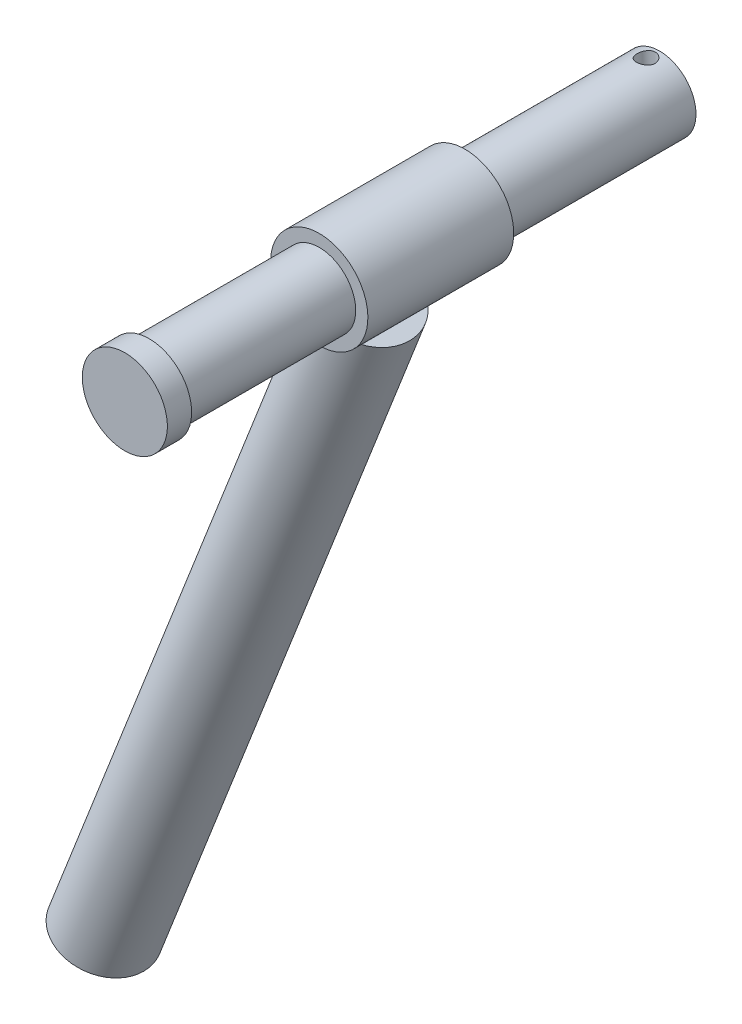
ISO-10303-21;
HEADER;
FILE_DESCRIPTION(('STEP AP214'),'2;1');
FILE_NAME('part.step','',(''),(''),'','','');
FILE_SCHEMA(('AUTOMOTIVE_DESIGN { 1 0 10303 214 1 1 1 1 }'));
ENDSEC;
DATA;
#1=APPLICATION_CONTEXT('core data for automotive mechanical design processes');
#2=APPLICATION_PROTOCOL_DEFINITION('international standard','automotive_design',2000,#1);
#3=PRODUCT_CONTEXT('',#1,'mechanical');
#4=PRODUCT('Part','Part','',(#3));
#5=PRODUCT_RELATED_PRODUCT_CATEGORY('part','',(#4));
#6=PRODUCT_DEFINITION_FORMATION('','',#4);
#7=PRODUCT_DEFINITION_CONTEXT('part definition',#1,'design');
#8=PRODUCT_DEFINITION('design','',#6,#7);
#9=PRODUCT_DEFINITION_SHAPE('','',#8);
#10=(LENGTH_UNIT() NAMED_UNIT(*) SI_UNIT(.MILLI.,.METRE.));
#11=(NAMED_UNIT(*) PLANE_ANGLE_UNIT() SI_UNIT($,.RADIAN.));
#12=(NAMED_UNIT(*) SI_UNIT($,.STERADIAN.) SOLID_ANGLE_UNIT());
#13=UNCERTAINTY_MEASURE_WITH_UNIT(LENGTH_MEASURE(1.E-05),#10,'distance_accuracy_value','');
#14=(GEOMETRIC_REPRESENTATION_CONTEXT(3) GLOBAL_UNCERTAINTY_ASSIGNED_CONTEXT((#13)) GLOBAL_UNIT_ASSIGNED_CONTEXT((#10,
#11,#12)) REPRESENTATION_CONTEXT('',''));
#15=CARTESIAN_POINT('',(0.,0.,0.));
#16=DIRECTION('',(0.,0.,1.));
#17=DIRECTION('',(1.,0.,0.));
#18=AXIS2_PLACEMENT_3D('',#15,#16,#17);
#19=CARTESIAN_POINT('',(-246.40968033927,1110.73942071581,4229.13224485644));
#20=DIRECTION('',(0.,0.,-1.));
#21=DIRECTION('',(-0.0385253158153091,0.999257624459944,0.));
#22=AXIS2_PLACEMENT_3D('',#19,#20,#21);
#23=PLANE('',#22);
#24=CARTESIAN_POINT('',(-246.40968033927,1110.73942071581,4229.13224485644));
#25=DIRECTION('',(0.,0.,1.));
#26=DIRECTION('',(0.0385253158153091,-0.999257624459944,0.));
#27=AXIS2_PLACEMENT_3D('',#24,#25,#26);
#28=CIRCLE('',#27,35.);
#29=CARTESIAN_POINT('',(-245.061294285735,1075.76540385971,4229.13224485644));
#30=VERTEX_POINT('',#29);
#31=EDGE_CURVE('P0_E30',#30,#30,#28,.T.);
#32=ORIENTED_EDGE('',*,*,#31,.T.);
#33=EDGE_LOOP('',(#32));
#34=FACE_BOUND('',#33,.T.);
#35=ADVANCED_FACE('P0_F15',(#34),#23,.F.);
#36=CARTESIAN_POINT('',(-246.40968033927,1110.73942071581,4229.13224485644));
#37=DIRECTION('',(0.,0.,1.));
#38=DIRECTION('',(0.0385253158153091,-0.999257624459944,0.));
#39=AXIS2_PLACEMENT_3D('',#36,#37,#38);
#40=CYLINDRICAL_SURFACE('',#39,35.);
#41=ORIENTED_EDGE('',*,*,#31,.F.);
#42=EDGE_LOOP('',(#41));
#43=FACE_BOUND('',#42,.T.);
#44=CARTESIAN_POINT('',(-246.40968033927,1110.73942071581,4209.13224485644));
#45=DIRECTION('',(0.,0.,1.));
#46=DIRECTION('',(0.0385253158153091,-0.999257624459944,0.));
#47=AXIS2_PLACEMENT_3D('',#44,#45,#46);
#48=CIRCLE('',#47,35.);
#49=CARTESIAN_POINT('',(-245.061294285735,1075.76540385971,4209.13224485644));
#50=VERTEX_POINT('',#49);
#51=EDGE_CURVE('P0_E34',#50,#50,#48,.T.);
#52=ORIENTED_EDGE('',*,*,#51,.T.);
#53=EDGE_LOOP('',(#52));
#54=FACE_BOUND('',#53,.T.);
#55=ADVANCED_FACE('P0_F59',(#43,#54),#40,.T.);
#56=CARTESIAN_POINT('',(-211.435663483172,1112.08780676934,4209.13224485644));
#57=DIRECTION('',(0.,0.,1.));
#58=DIRECTION('',(0.0385253158153091,-0.999257624459944,0.));
#59=AXIS2_PLACEMENT_3D('',#56,#57,#58);
#60=PLANE('',#59);
#61=ORIENTED_EDGE('',*,*,#51,.F.);
#62=EDGE_LOOP('',(#61));
#63=FACE_BOUND('',#62,.T.);
#64=CARTESIAN_POINT('',(-246.40968033927,1110.73942071581,4209.13224485644));
#65=DIRECTION('',(0.,0.,1.));
#66=DIRECTION('',(0.0385253158153091,-0.999257624459944,0.));
#67=AXIS2_PLACEMENT_3D('',#64,#65,#66);
#68=CIRCLE('',#67,30.);
#69=CARTESIAN_POINT('',(-245.253920864811,1080.76169198201,4209.13224485644));
#70=VERTEX_POINT('',#69);
#71=EDGE_CURVE('P0_E70',#70,#70,#68,.T.);
#72=ORIENTED_EDGE('',*,*,#71,.T.);
#73=EDGE_LOOP('',(#72));
#74=FACE_BOUND('',#73,.T.);
#75=ADVANCED_FACE('P0_F56',(#63,#74),#60,.F.);
#76=CARTESIAN_POINT('',(-246.40968033927,1110.73942071581,4229.13224485644));
#77=DIRECTION('',(0.,0.,1.));
#78=DIRECTION('',(0.0385253158153091,-0.999257624459944,0.));
#79=AXIS2_PLACEMENT_3D('',#76,#77,#78);
#80=CYLINDRICAL_SURFACE('',#79,30.);
#81=CARTESIAN_POINT('',(-247.56543981373,1140.71714944961,3791.63224485644));
#82=CARTESIAN_POINT('',(-247.358337086096,1140.72513782331,3791.63223867022));
#83=CARTESIAN_POINT('',(-247.151218849185,1140.73096674286,3791.64083720005));
#84=CARTESIAN_POINT('',(-246.738268834767,1140.73833083118,3791.67514468396));
#85=CARTESIAN_POINT('',(-246.532437206743,1140.73986550997,3791.70085559024));
#86=CARTESIAN_POINT('',(-246.123558346959,1140.73875352032,3791.76918950556));
#87=CARTESIAN_POINT('',(-245.920511999221,1140.73610555398,3791.81181776113));
#88=CARTESIAN_POINT('',(-245.518631878488,1140.72685879017,3791.91364976589));
#89=CARTESIAN_POINT('',(-245.319799687216,1140.72025853554,3791.97285962424));
#90=CARTESIAN_POINT('',(-244.928130764378,1140.70345545966,3792.10726634565));
#91=CARTESIAN_POINT('',(-244.735284978047,1140.69325839984,3792.18243756532));
#92=CARTESIAN_POINT('',(-244.356496072312,1140.6696806715,3792.34827659609));
#93=CARTESIAN_POINT('',(-244.17055553417,1140.65629882605,3792.43895013256));
#94=CARTESIAN_POINT('',(-243.806950920499,1140.62686057411,3792.63507302377));
#95=CARTESIAN_POINT('',(-243.629283841729,1140.61080514797,3792.7405169603));
#96=CARTESIAN_POINT('',(-243.283239351437,1140.57657228087,3792.96550891946));
#97=CARTESIAN_POINT('',(-243.114865517409,1140.55839403099,3793.08506231879));
#98=CARTESIAN_POINT('',(-242.785604954379,1140.52018705831,3793.3397217745));
#99=CARTESIAN_POINT('',(-242.624908638736,1140.50013082052,3793.47506994865));
#100=CARTESIAN_POINT('',(-242.31533011859,1140.45912283026,3793.75867350452));
#101=CARTESIAN_POINT('',(-242.166453338194,1140.43817067336,3793.90693474748));
#102=CARTESIAN_POINT('',(-241.881573983174,1140.39607246005,3794.21535669573));
#103=CARTESIAN_POINT('',(-241.745572881825,1140.37492638176,3794.37551875902));
#104=CARTESIAN_POINT('',(-241.487455444067,1140.33314965595,3794.70661208443));
#105=CARTESIAN_POINT('',(-241.365332873296,1140.31251878027,3794.87753845707));
#106=CARTESIAN_POINT('',(-241.134006892295,1140.27213600111,3795.23181361859));
#107=CARTESIAN_POINT('',(-241.025030245775,1140.25240242191,3795.41531267954));
#108=CARTESIAN_POINT('',(-240.823085782937,1140.21484287721,3795.79101473745));
#109=CARTESIAN_POINT('',(-240.730111736995,1140.19701617042,3795.98321431044));
#110=CARTESIAN_POINT('',(-240.560844751634,1140.16387597989,3796.37509978747));
#111=CARTESIAN_POINT('',(-240.484556373064,1140.14856318358,3796.57478772094));
#112=CARTESIAN_POINT('',(-240.349366961055,1140.12100278572,3796.9800834065));
#113=CARTESIAN_POINT('',(-240.290458709359,1140.10875391199,3797.18568866199));
#114=CARTESIAN_POINT('',(-240.191491474252,1140.08795791024,3797.59728619899));
#115=CARTESIAN_POINT('',(-240.151084796114,1140.07934276227,3797.80319145979));
#116=CARTESIAN_POINT('',(-240.087810348088,1140.06577421965,3798.21772055964));
#117=CARTESIAN_POINT('',(-240.064935799543,1140.06081940978,3798.42634331623));
#118=CARTESIAN_POINT('',(-240.036906425477,1140.05474024843,3798.84484132751));
#119=CARTESIAN_POINT('',(-240.031752404416,1140.05361607086,3799.05471663864));
#120=CARTESIAN_POINT('',(-240.03921369448,1140.05523845682,3799.4741344724));
#121=CARTESIAN_POINT('',(-240.051828758528,1140.05798496654,3799.68367699962));
#122=CARTESIAN_POINT('',(-240.094186999217,1140.06713792488,3800.09575564696));
#123=CARTESIAN_POINT('',(-240.123503788864,1140.07345323258,3800.29833779712));
#124=CARTESIAN_POINT('',(-240.198699739788,1140.08946664606,3800.7003396897));
#125=CARTESIAN_POINT('',(-240.244584590407,1140.09916591381,3800.8997583212));
#126=CARTESIAN_POINT('',(-240.352517711047,1140.12162305248,3801.29392516627));
#127=CARTESIAN_POINT('',(-240.414560933114,1140.13437996807,3801.48867481774));
#128=CARTESIAN_POINT('',(-240.554348787623,1140.16254382008,3801.87233636832));
#129=CARTESIAN_POINT('',(-240.632099304773,1140.17795174938,3802.06124604883));
#130=CARTESIAN_POINT('',(-240.803524969821,1140.21108019382,3802.4337264634));
#131=CARTESIAN_POINT('',(-240.897347581057,1140.22882173461,3802.61722744146));
#132=CARTESIAN_POINT('',(-241.099722671311,1140.26593305886,3802.97582584951));
#133=CARTESIAN_POINT('',(-241.208280222069,1140.28530340209,3803.1509203578));
#134=CARTESIAN_POINT('',(-241.439331644222,1140.32504846313,3803.49152997224));
#135=CARTESIAN_POINT('',(-241.56182517509,1140.34542315639,3803.65704531232));
#136=CARTESIAN_POINT('',(-241.819922689047,1140.38653181679,3803.97747093483));
#137=CARTESIAN_POINT('',(-241.955526925736,1140.40726579086,3804.13238101202));
#138=CARTESIAN_POINT('',(-242.24303190235,1140.44902752277,3804.43491428173));
#139=CARTESIAN_POINT('',(-242.395288847069,1140.47004661371,3804.58220037956));
#140=CARTESIAN_POINT('',(-242.711651360145,1140.51105166991,3804.86348941022));
#141=CARTESIAN_POINT('',(-242.875752980989,1140.53103797561,3804.9974967335));
#142=CARTESIAN_POINT('',(-243.214816780732,1140.56930438335,3805.25141537367));
#143=CARTESIAN_POINT('',(-243.389783337863,1140.58758379005,3805.37132095092));
#144=CARTESIAN_POINT('',(-243.74926373821,1140.62176942063,3805.59607179972));
#145=CARTESIAN_POINT('',(-243.93377385553,1140.63767656139,3805.70092288922));
#146=CARTESIAN_POINT('',(-244.311864641906,1140.66658643908,3805.8952105836));
#147=CARTESIAN_POINT('',(-244.505477485887,1140.67957776294,3805.98458631357));
#148=CARTESIAN_POINT('',(-244.899667236642,1140.70204431712,3806.1466923577));
#149=CARTESIAN_POINT('',(-245.100241530758,1140.71152085129,3806.21942884046));
#150=CARTESIAN_POINT('',(-245.506971583608,1140.72652673913,3806.34770075567));
#151=CARTESIAN_POINT('',(-245.713127525041,1140.73205596344,3806.40323562433));
#152=CARTESIAN_POINT('',(-246.12947486424,1140.7388344684,3806.49662272202));
#153=CARTESIAN_POINT('',(-246.339666162383,1140.74008385458,3806.534475387));
#154=CARTESIAN_POINT('',(-246.757068784174,1140.73811667892,3806.59142569274));
#155=CARTESIAN_POINT('',(-246.964218609921,1140.73501364595,3806.61097872907));
#156=CARTESIAN_POINT('',(-247.379315495896,1140.7244654562,3806.63281269411));
#157=CARTESIAN_POINT('',(-247.587262543462,1140.71702036811,3806.635093896));
#158=CARTESIAN_POINT('',(-248.002409313601,1140.69783174135,3806.62236532263));
#159=CARTESIAN_POINT('',(-248.20960909715,1140.68608856181,3806.60735699175));
#160=CARTESIAN_POINT('',(-248.621765933442,1140.65846710457,3806.56018091464));
#161=CARTESIAN_POINT('',(-248.826722994949,1140.64258884304,3806.52801323549));
#162=CARTESIAN_POINT('',(-249.229864520089,1140.60724441794,3806.44740248982));
#163=CARTESIAN_POINT('',(-249.428104474579,1140.58783575881,3806.39921127237));
#164=CARTESIAN_POINT('',(-249.819693222606,1140.54563833033,3806.28681278627));
#165=CARTESIAN_POINT('',(-250.013040335856,1140.52284841777,3806.22260009563));
#166=CARTESIAN_POINT('',(-250.393436492925,1140.47435714248,3806.07868260636));
#167=CARTESIAN_POINT('',(-250.580487288435,1140.44865659834,3805.99898215907));
#168=CARTESIAN_POINT('',(-250.947213078395,1140.3948613664,3805.82463479225));
#169=CARTESIAN_POINT('',(-251.126885277543,1140.36676578343,3805.72998227292));
#170=CARTESIAN_POINT('',(-251.480708656599,1140.30827906857,3805.52464978585));
#171=CARTESIAN_POINT('',(-251.654709553265,1140.27785652051,3805.4137197923));
#172=CARTESIAN_POINT('',(-251.99279630013,1140.21582433376,3805.17783899009));
#173=CARTESIAN_POINT('',(-252.156878684592,1140.1842142863,3805.05288332365));
#174=CARTESIAN_POINT('',(-252.474039621808,1140.12053220787,3804.78982391624));
#175=CARTESIAN_POINT('',(-252.627118359137,1140.08846018464,3804.65172039591));
#176=CARTESIAN_POINT('',(-252.921324695337,1140.02459021981,3804.36326245903));
#177=CARTESIAN_POINT('',(-253.06245215885,1139.99279228132,3804.21290790375));
#178=CARTESIAN_POINT('',(-253.335207590831,1139.92943890745,3803.89703927996));
#179=CARTESIAN_POINT('',(-253.466513726955,1139.89790898205,3803.7312419885));
#180=CARTESIAN_POINT('',(-253.71471060486,1139.83672076632,3803.3889508655));
#181=CARTESIAN_POINT('',(-253.83160629076,1139.80706183577,3803.21246073375));
#182=CARTESIAN_POINT('',(-254.05025365271,1139.75035667901,3802.84984746878));
#183=CARTESIAN_POINT('',(-254.151999990713,1139.7233113749,3802.66372097105));
#184=CARTESIAN_POINT('',(-254.339512433457,1139.67257124205,3802.28323711455));
#185=CARTESIAN_POINT('',(-254.425284934312,1139.6488750732,3802.08888308861));
#186=CARTESIAN_POINT('',(-254.579801034321,1139.60558662318,3801.69434694114));
#187=CARTESIAN_POINT('',(-254.648637566948,1139.58597204091,3801.4942036822));
#188=CARTESIAN_POINT('',(-254.769326835679,1139.55122831996,3801.08856090235));
#189=CARTESIAN_POINT('',(-254.821186110534,1139.5360974546,3800.88306347659));
#190=CARTESIAN_POINT('',(-254.907522556826,1139.51073812822,3800.46814733937));
#191=CARTESIAN_POINT('',(-254.941999579751,1139.50050970909,3800.25872859444));
#192=CARTESIAN_POINT('',(-254.99327105475,1139.48524979664,3799.83755135423));
#193=CARTESIAN_POINT('',(-255.010065932249,1139.48021817829,3799.62579291538));
#194=CARTESIAN_POINT('',(-255.025598393877,1139.47556549081,3799.20769681854));
#195=CARTESIAN_POINT('',(-255.024844311735,1139.47579210789,3799.00137956456));
#196=CARTESIAN_POINT('',(-255.006527792417,1139.48127705121,3798.58948727102));
#197=CARTESIAN_POINT('',(-254.988959558592,1139.48653711272,3798.38391251198));
#198=CARTESIAN_POINT('',(-254.93716291714,1139.50194438747,3797.97514264442));
#199=CARTESIAN_POINT('',(-254.902941054651,1139.51208968072,3797.77194663311));
#200=CARTESIAN_POINT('',(-254.818103674855,1139.53699646331,3797.36921744513));
#201=CARTESIAN_POINT('',(-254.767482057249,1139.55175967034,3797.16968566069));
#202=CARTESIAN_POINT('',(-254.650621514109,1139.58540062848,3796.77699675732));
#203=CARTESIAN_POINT('',(-254.584483698658,1139.60425168368,3796.58380722876));
#204=CARTESIAN_POINT('',(-254.436890772166,1139.64564434346,3796.20370586578));
#205=CARTESIAN_POINT('',(-254.35543042868,1139.6681872084,3796.01679620164));
#206=CARTESIAN_POINT('',(-254.177795504311,1139.71639175352,3795.65054388048));
#207=CARTESIAN_POINT('',(-254.081621968445,1139.74205321216,3795.47120068721));
#208=CARTESIAN_POINT('',(-253.875209364852,1139.79587004291,3795.12119113034));
#209=CARTESIAN_POINT('',(-253.76496991107,1139.82402548346,3794.95052500507));
#210=CARTESIAN_POINT('',(-253.528069982596,1139.88292445012,3794.61456834478));
#211=CARTESIAN_POINT('',(-253.401054267384,1139.91371652833,3794.4495367217));
#212=CARTESIAN_POINT('',(-253.13384573842,1139.9764592569,3794.13084180318));
#213=CARTESIAN_POINT('',(-252.993657127414,1140.00840953575,3793.97717490964));
#214=CARTESIAN_POINT('',(-252.700881256619,1140.07273389036,3793.68205883437));
#215=CARTESIAN_POINT('',(-252.548286862571,1140.10510820087,3793.54061678067));
#216=CARTESIAN_POINT('',(-252.231795191763,1140.16949110645,3793.27103416026));
#217=CARTESIAN_POINT('',(-252.067902034909,1140.20149982992,3793.14288878739));
#218=CARTESIAN_POINT('',(-251.726662489582,1140.26500904449,3792.89846586675));
#219=CARTESIAN_POINT('',(-251.549123062498,1140.29648912182,3792.7824522856));
#220=CARTESIAN_POINT('',(-251.184594065688,1140.35756279691,3792.56596148462));
#221=CARTESIAN_POINT('',(-250.99760800379,1140.38715708584,3792.46547855324));
#222=CARTESIAN_POINT('',(-250.615468371739,1140.44377415283,3792.28080799747));
#223=CARTESIAN_POINT('',(-250.420318366695,1140.47079803684,3792.19661334867));
#224=CARTESIAN_POINT('',(-250.023221073189,1140.52167123074,3792.04516191207));
#225=CARTESIAN_POINT('',(-249.821274815332,1140.54552101928,3791.97790256917));
#226=CARTESIAN_POINT('',(-249.284547130893,1140.60321691259,3791.82445378905));
#227=CARTESIAN_POINT('',(-248.945252326699,1140.63405689489,3791.75250063413));
#228=CARTESIAN_POINT('',(-248.25913240932,1140.68433303124,3791.65640314626));
#229=CARTESIAN_POINT('',(-247.912307864493,1140.70377004293,3791.63225521748));
#230=CARTESIAN_POINT('',(-247.56543981373,1140.71714944961,3791.63224485644));
#231=B_SPLINE_CURVE_WITH_KNOTS('',3,(#81,#82,#83,#84,#85,#86,#87,#88,#89,#90,#91,#92,#93,#94,
#95,#96,#97,#98,#99,#100,#101,#102,#103,#104,#105,#106,#107,#108,#109,#110,#111,#112,#113,#114,
#115,#116,#117,#118,#119,#120,#121,#122,#123,#124,#125,#126,#127,#128,#129,#130,#131,#132,#133,
#134,#135,#136,#137,#138,#139,#140,#141,#142,#143,#144,#145,#146,#147,#148,#149,#150,#151,#152,
#153,#154,#155,#156,#157,#158,#159,#160,#161,#162,#163,#164,#165,#166,#167,#168,#169,#170,#171,
#172,#173,#174,#175,#176,#177,#178,#179,#180,#181,#182,#183,#184,#185,#186,#187,#188,#189,#190,
#191,#192,#193,#194,#195,#196,#197,#198,#199,#200,#201,#202,#203,#204,#205,#206,#207,#208,#209,
#210,#211,#212,#213,#214,#215,#216,#217,#218,#219,#220,#221,#222,#223,#224,#225,#226,#227,#228,
#229,#230),.UNSPECIFIED.,.T.,.F.,(4,2,2,2,2,2,2,2,2,2,2,2,2,2,2,2,2,2,2,2,2,2,2,2,2,2,2,2,2,2,2,
2,2,2,2,2,2,2,2,2,2,2,2,2,2,2,2,2,2,2,2,2,2,2,2,2,2,2,2,2,2,2,2,2,2,2,2,2,2,2,2,2,2,2,4),(0.,
0.62146431701044,1.24299954382041,1.86472767684072,2.48668517567912,3.10765090273788,
3.72884646419176,4.34981474719269,4.9710204322486,5.60345785394225,6.23618384989157,
6.86898215694667,7.50149507214984,8.14370490718976,8.78566416935024,9.42779868557237,
10.0696661359823,10.6989188565585,11.3279281587942,11.9569660158717,12.5859951263179,
13.1996422302779,13.8135002565377,14.4271667401156,15.0410635604958,15.6609283810613,
16.2810071015706,16.9010706736338,17.5211462419403,18.159031896817,18.7967059344352,
19.4346386236677,20.0723241105669,20.7124637031902,21.3523655930574,21.992288453434,
22.6321955359513,23.2557181786967,23.8792309598842,24.5026916557759,25.1261499140132,
25.740238922497,26.3545360338667,26.9686608054557,27.5830161248212,28.2080518295536,
28.8333046873221,29.4585470546532,30.0837965025262,30.7245311303909,31.3650453114752,
32.005784653642,32.6462668819264,33.2831519874557,33.9197915088554,34.5564364695184,
35.1930661124365,35.8112783348091,36.4297037614805,37.0478863332829,37.6662991180849,
38.2807888234881,38.8954887514427,39.5101450400984,40.1248182023237,40.75563524146,
41.3862517005312,42.0172334122505,42.6479862516883,43.290429055322,43.932635028853,
44.5745634267958,45.2163949154785,46.2573388715185,47.298204526563),.UNSPECIFIED.);
#232=CARTESIAN_POINT('',(-247.56543981373,1140.71714944961,3791.63224485644));
#233=VERTEX_POINT('',#232);
#234=EDGE_CURVE('P0_E10',#233,#233,#231,.T.);
#235=ORIENTED_EDGE('',*,*,#234,.T.);
#236=EDGE_LOOP('',(#235));
#237=FACE_BOUND('',#236,.T.);
#238=CARTESIAN_POINT('',(-245.253920864811,1080.76169198201,3791.63224485644));
#239=CARTESIAN_POINT('',(-245.461023592445,1080.7537036083,3791.63223867022));
#240=CARTESIAN_POINT('',(-245.668141829356,1080.74787468876,3791.64083720005));
#241=CARTESIAN_POINT('',(-246.081091843774,1080.74051060043,3791.67514468396));
#242=CARTESIAN_POINT('',(-246.286923471798,1080.73897592165,3791.70085559024));
#243=CARTESIAN_POINT('',(-246.695802331582,1080.74008791129,3791.76918950556));
#244=CARTESIAN_POINT('',(-246.89884867932,1080.74273587764,3791.81181776113));
#245=CARTESIAN_POINT('',(-247.300728800053,1080.75198264145,3791.91364976589));
#246=CARTESIAN_POINT('',(-247.499560991325,1080.75858289608,3791.97285962424));
#247=CARTESIAN_POINT('',(-247.891229914163,1080.77538597196,3792.10726634565));
#248=CARTESIAN_POINT('',(-248.084075700494,1080.78558303178,3792.18243756532));
#249=CARTESIAN_POINT('',(-248.462864606229,1080.80916076011,3792.34827659609));
#250=CARTESIAN_POINT('',(-248.648805144371,1080.82254260556,3792.43895013256));
#251=CARTESIAN_POINT('',(-249.012409758042,1080.8519808575,3792.63507302377));
#252=CARTESIAN_POINT('',(-249.190076836812,1080.86803628365,3792.7405169603));
#253=CARTESIAN_POINT('',(-249.536121327104,1080.90226915075,3792.96550891946));
#254=CARTESIAN_POINT('',(-249.704495161132,1080.92044740062,3793.08506231879));
#255=CARTESIAN_POINT('',(-250.033755724162,1080.95865437331,3793.3397217745));
#256=CARTESIAN_POINT('',(-250.194452039805,1080.9787106111,3793.47506994865));
#257=CARTESIAN_POINT('',(-250.504030559951,1081.01971860135,3793.75867350452));
#258=CARTESIAN_POINT('',(-250.652907340347,1081.04067075826,3793.90693474748));
#259=CARTESIAN_POINT('',(-250.937786695367,1081.08276897156,3794.21535669573));
#260=CARTESIAN_POINT('',(-251.073787796716,1081.10391504985,3794.37551875902));
#261=CARTESIAN_POINT('',(-251.331905234474,1081.14569177567,3794.70661208443));
#262=CARTESIAN_POINT('',(-251.454027805245,1081.16632265135,3794.87753845707));
#263=CARTESIAN_POINT('',(-251.685353786246,1081.2067054305,3795.23181361859));
#264=CARTESIAN_POINT('',(-251.794330432765,1081.22643900971,3795.41531267954));
#265=CARTESIAN_POINT('',(-251.996274895604,1081.26399855441,3795.79101473745));
#266=CARTESIAN_POINT('',(-252.089248941546,1081.2818252612,3795.98321431044));
#267=CARTESIAN_POINT('',(-252.258515926907,1081.31496545173,3796.37509978747));
#268=CARTESIAN_POINT('',(-252.334804305477,1081.33027824803,3796.57478772094));
#269=CARTESIAN_POINT('',(-252.469993717486,1081.35783864589,3796.9800834065));
#270=CARTESIAN_POINT('',(-252.528901969182,1081.37008751963,3797.18568866199));
#271=CARTESIAN_POINT('',(-252.627869204289,1081.39088352138,3797.59728619899));
#272=CARTESIAN_POINT('',(-252.668275882427,1081.39949866934,3797.80319145979));
#273=CARTESIAN_POINT('',(-252.731550330453,1081.41306721196,3798.21772055964));
#274=CARTESIAN_POINT('',(-252.754424878998,1081.41802202184,3798.42634331623));
#275=CARTESIAN_POINT('',(-252.782454253064,1081.42410118319,3798.84484132751));
#276=CARTESIAN_POINT('',(-252.787608274125,1081.42522536076,3799.05471663864));
#277=CARTESIAN_POINT('',(-252.780146984061,1081.42360297479,3799.4741344724));
#278=CARTESIAN_POINT('',(-252.767531920013,1081.42085646507,3799.68367699962));
#279=CARTESIAN_POINT('',(-252.725173679324,1081.41170350673,3800.09575564696));
#280=CARTESIAN_POINT('',(-252.695856889676,1081.40538819903,3800.29833779712));
#281=CARTESIAN_POINT('',(-252.620660938753,1081.38937478556,3800.7003396897));
#282=CARTESIAN_POINT('',(-252.574776088134,1081.3796755178,3800.8997583212));
#283=CARTESIAN_POINT('',(-252.466842967494,1081.35721837914,3801.29392516627));
#284=CARTESIAN_POINT('',(-252.404799745427,1081.34446146355,3801.48867481774));
#285=CARTESIAN_POINT('',(-252.265011890918,1081.31629761154,3801.87233636832));
#286=CARTESIAN_POINT('',(-252.187261373768,1081.30088968224,3802.06124604883));
#287=CARTESIAN_POINT('',(-252.01583570872,1081.2677612378,3802.4337264634));
#288=CARTESIAN_POINT('',(-251.922013097484,1081.25001969701,3802.61722744146));
#289=CARTESIAN_POINT('',(-251.71963800723,1081.21290837275,3802.97582584951));
#290=CARTESIAN_POINT('',(-251.611080456472,1081.19353802953,3803.1509203578));
#291=CARTESIAN_POINT('',(-251.380029034319,1081.15379296849,3803.49152997224));
#292=CARTESIAN_POINT('',(-251.257535503451,1081.13341827522,3803.65704531232));
#293=CARTESIAN_POINT('',(-250.999437989494,1081.09230961483,3803.97747093483));
#294=CARTESIAN_POINT('',(-250.863833752805,1081.07157564076,3804.13238101202));
#295=CARTESIAN_POINT('',(-250.576328776191,1081.02981390885,3804.43491428173));
#296=CARTESIAN_POINT('',(-250.424071831472,1081.00879481791,3804.58220037956));
#297=CARTESIAN_POINT('',(-250.107709318396,1080.9677897617,3804.86348941022));
#298=CARTESIAN_POINT('',(-249.943607697552,1080.94780345601,3804.9974967335));
#299=CARTESIAN_POINT('',(-249.604543897809,1080.90953704827,3805.25141537367));
#300=CARTESIAN_POINT('',(-249.429577340678,1080.89125764157,3805.37132095092));
#301=CARTESIAN_POINT('',(-249.070096940331,1080.85707201099,3805.59607179972));
#302=CARTESIAN_POINT('',(-248.885586823011,1080.84116487022,3805.70092288922));
#303=CARTESIAN_POINT('',(-248.507496036635,1080.81225499253,3805.8952105836));
#304=CARTESIAN_POINT('',(-248.313883192654,1080.79926366868,3805.98458631357));
#305=CARTESIAN_POINT('',(-247.919693441899,1080.77679711449,3806.1466923577));
#306=CARTESIAN_POINT('',(-247.719119147783,1080.76732058033,3806.21942884046));
#307=CARTESIAN_POINT('',(-247.312389094933,1080.75231469249,3806.34770075567));
#308=CARTESIAN_POINT('',(-247.1062331535,1080.74678546818,3806.40323562433));
#309=CARTESIAN_POINT('',(-246.689885814301,1080.74000696322,3806.49662272202));
#310=CARTESIAN_POINT('',(-246.479694516158,1080.73875757704,3806.534475387));
#311=CARTESIAN_POINT('',(-246.062291894367,1080.74072475269,3806.59142569274));
#312=CARTESIAN_POINT('',(-245.85514206862,1080.74382778567,3806.61097872907));
#313=CARTESIAN_POINT('',(-245.440045182645,1080.75437597541,3806.63281269411));
#314=CARTESIAN_POINT('',(-245.232098135079,1080.76182106351,3806.635093896));
#315=CARTESIAN_POINT('',(-244.81695136494,1080.78100969026,3806.62236532263));
#316=CARTESIAN_POINT('',(-244.609751581391,1080.7927528698,3806.60735699175));
#317=CARTESIAN_POINT('',(-244.197594745099,1080.82037432704,3806.56018091464));
#318=CARTESIAN_POINT('',(-243.992637683592,1080.83625258858,3806.52801323549));
#319=CARTESIAN_POINT('',(-243.589496158452,1080.87159701367,3806.44740248982));
#320=CARTESIAN_POINT('',(-243.391256203962,1080.89100567281,3806.39921127237));
#321=CARTESIAN_POINT('',(-242.999667455935,1080.93320310128,3806.28681278627));
#322=CARTESIAN_POINT('',(-242.806320342685,1080.95599301385,3806.22260009563));
#323=CARTESIAN_POINT('',(-242.425924185616,1081.00448428914,3806.07868260636));
#324=CARTESIAN_POINT('',(-242.238873390106,1081.03018483327,3805.99898215907));
#325=CARTESIAN_POINT('',(-241.872147600146,1081.08398006522,3805.82463479225));
#326=CARTESIAN_POINT('',(-241.692475400998,1081.11207564818,3805.72998227292));
#327=CARTESIAN_POINT('',(-241.338652021941,1081.17056236304,3805.52464978585));
#328=CARTESIAN_POINT('',(-241.164651125276,1081.2009849111,3805.4137197923));
#329=CARTESIAN_POINT('',(-240.82656437841,1081.26301709786,3805.17783899009));
#330=CARTESIAN_POINT('',(-240.662481993948,1081.29462714531,3805.05288332364));
#331=CARTESIAN_POINT('',(-240.345321056733,1081.35830922375,3804.78982391624));
#332=CARTESIAN_POINT('',(-240.192242319404,1081.39038124698,3804.65172039591));
#333=CARTESIAN_POINT('',(-239.898035983203,1081.4542512118,3804.36326245903));
#334=CARTESIAN_POINT('',(-239.756908519691,1081.4860491503,3804.21290790375));
#335=CARTESIAN_POINT('',(-239.48415308771,1081.54940252417,3803.89703927996));
#336=CARTESIAN_POINT('',(-239.352846951586,1081.58093244957,3803.7312419885));
#337=CARTESIAN_POINT('',(-239.104650073682,1081.6421206653,3803.3889508655));
#338=CARTESIAN_POINT('',(-238.987754387781,1081.67177959584,3803.21246073375));
#339=CARTESIAN_POINT('',(-238.769107025831,1081.72848475261,3802.84984746878));
#340=CARTESIAN_POINT('',(-238.667360687828,1081.75553005672,3802.66372097105));
#341=CARTESIAN_POINT('',(-238.479848245084,1081.80627018957,3802.28323711455));
#342=CARTESIAN_POINT('',(-238.394075744229,1081.82996635842,3802.08888308861));
#343=CARTESIAN_POINT('',(-238.23955964422,1081.87325480843,3801.69434694114));
#344=CARTESIAN_POINT('',(-238.170723111593,1081.89286939071,3801.4942036822));
#345=CARTESIAN_POINT('',(-238.050033842861,1081.92761311166,3801.08856090235));
#346=CARTESIAN_POINT('',(-237.998174568007,1081.94274397702,3800.88306347659));
#347=CARTESIAN_POINT('',(-237.911838121715,1081.9681033034,3800.46814733937));
#348=CARTESIAN_POINT('',(-237.87736109879,1081.97833172253,3800.25872859443));
#349=CARTESIAN_POINT('',(-237.826089623791,1081.99359163498,3799.83755135423));
#350=CARTESIAN_POINT('',(-237.809294746292,1081.99862325333,3799.62579291538));
#351=CARTESIAN_POINT('',(-237.793762284664,1082.00327594081,3799.20769681854));
#352=CARTESIAN_POINT('',(-237.794516366806,1082.00304932373,3799.00137956456));
#353=CARTESIAN_POINT('',(-237.812832886124,1081.99756438041,3798.58948727102));
#354=CARTESIAN_POINT('',(-237.830401119949,1081.9923043189,3798.38391251198));
#355=CARTESIAN_POINT('',(-237.882197761401,1081.97689704415,3797.97514264442));
#356=CARTESIAN_POINT('',(-237.91641962389,1081.9667517509,3797.77194663311));
#357=CARTESIAN_POINT('',(-238.001257003686,1081.9418449683,3797.36921744513));
#358=CARTESIAN_POINT('',(-238.051878621292,1081.92708176128,3797.16968566069));
#359=CARTESIAN_POINT('',(-238.168739164432,1081.89344080314,3796.77699675732));
#360=CARTESIAN_POINT('',(-238.234876979883,1081.87458974794,3796.58380722876));
#361=CARTESIAN_POINT('',(-238.382469906375,1081.83319708816,3796.20370586578));
#362=CARTESIAN_POINT('',(-238.463930249861,1081.81065422321,3796.01679620164));
#363=CARTESIAN_POINT('',(-238.64156517423,1081.7624496781,3795.65054388048));
#364=CARTESIAN_POINT('',(-238.737738710096,1081.73678821946,3795.47120068721));
#365=CARTESIAN_POINT('',(-238.944151313689,1081.68297138871,3795.12119113034));
#366=CARTESIAN_POINT('',(-239.054390767471,1081.65481594816,3794.95052500507));
#367=CARTESIAN_POINT('',(-239.291290695945,1081.5959169815,3794.61456834478));
#368=CARTESIAN_POINT('',(-239.418306411156,1081.56512490328,3794.4495367217));
#369=CARTESIAN_POINT('',(-239.685514940121,1081.50238217471,3794.13084180318));
#370=CARTESIAN_POINT('',(-239.825703551127,1081.47043189587,3793.97717490964));
#371=CARTESIAN_POINT('',(-240.118479421922,1081.40610754126,3793.68205883437));
#372=CARTESIAN_POINT('',(-240.27107381597,1081.37373323075,3793.54061678067));
#373=CARTESIAN_POINT('',(-240.587565486777,1081.30935032516,3793.27103416026));
#374=CARTESIAN_POINT('',(-240.751458643632,1081.2773416017,3793.14288878739));
#375=CARTESIAN_POINT('',(-241.092698188959,1081.21383238713,3792.89846586675));
#376=CARTESIAN_POINT('',(-241.270237616043,1081.1823523098,3792.7824522856));
#377=CARTESIAN_POINT('',(-241.634766612852,1081.1212786347,3792.56596148462));
#378=CARTESIAN_POINT('',(-241.821752674751,1081.09168434578,3792.46547855324));
#379=CARTESIAN_POINT('',(-242.203892306802,1081.03506727878,3792.28080799747));
#380=CARTESIAN_POINT('',(-242.399042311846,1081.00804339478,3792.19661334867));
#381=CARTESIAN_POINT('',(-242.796139605352,1080.95717020087,3792.04516191207));
#382=CARTESIAN_POINT('',(-242.998085863209,1080.93332041234,3791.97790256917));
#383=CARTESIAN_POINT('',(-243.534813547648,1080.87562451902,3791.82445378905));
#384=CARTESIAN_POINT('',(-243.874108351842,1080.84478453673,3791.75250063413));
#385=CARTESIAN_POINT('',(-244.560228269221,1080.79450840038,3791.65640314626));
#386=CARTESIAN_POINT('',(-244.907052814048,1080.77507138869,3791.63225521748));
#387=CARTESIAN_POINT('',(-245.253920864811,1080.76169198201,3791.63224485644));
#388=B_SPLINE_CURVE_WITH_KNOTS('',3,(#238,#239,#240,#241,#242,#243,#244,#245,#246,#247,#248,
#249,#250,#251,#252,#253,#254,#255,#256,#257,#258,#259,#260,#261,#262,#263,#264,#265,#266,#267,
#268,#269,#270,#271,#272,#273,#274,#275,#276,#277,#278,#279,#280,#281,#282,#283,#284,#285,#286,
#287,#288,#289,#290,#291,#292,#293,#294,#295,#296,#297,#298,#299,#300,#301,#302,#303,#304,#305,
#306,#307,#308,#309,#310,#311,#312,#313,#314,#315,#316,#317,#318,#319,#320,#321,#322,#323,#324,
#325,#326,#327,#328,#329,#330,#331,#332,#333,#334,#335,#336,#337,#338,#339,#340,#341,#342,#343,
#344,#345,#346,#347,#348,#349,#350,#351,#352,#353,#354,#355,#356,#357,#358,#359,#360,#361,#362,
#363,#364,#365,#366,#367,#368,#369,#370,#371,#372,#373,#374,#375,#376,#377,#378,#379,#380,#381,
#382,#383,#384,#385,#386,#387),.UNSPECIFIED.,.T.,.F.,(4,2,2,2,2,2,2,2,2,2,2,2,2,2,2,2,2,2,2,2,2,
2,2,2,2,2,2,2,2,2,2,2,2,2,2,2,2,2,2,2,2,2,2,2,2,2,2,2,2,2,2,2,2,2,2,2,2,2,2,2,2,2,2,2,2,2,2,2,2,
2,2,2,2,2,4),(0.,0.62146431701044,1.24299954382041,1.86472767684072,2.48668517567912,
3.10765090273772,3.72884646419179,4.34981474719267,4.97102043224863,5.60345785394233,
6.23618384989163,6.86898215694671,7.50149507214988,8.14370490718979,8.78566416935029,
9.42779868557195,10.0696661359824,10.6989188565581,11.3279281587943,11.9569660158722,
12.5859951263179,13.199642230278,13.8135002565378,14.4271667401156,15.0410635604959,
15.6609283810617,16.2810071015706,16.9010706736345,17.5211462419404,18.159031896817,
18.7967059344353,19.4346386236678,20.072324110567,20.7124637031903,21.3523655930574,
21.9922884534341,22.6321955359513,23.2557181786969,23.8792309598843,24.502691655776,
25.1261499140133,25.7402389224969,26.3545360338667,26.9686608054558,27.5830161248213,
28.2080518295543,28.8333046873222,29.4585470546539,30.0837965025263,30.7245311303909,
31.3650453114752,32.005784653642,32.6462668819264,33.2831519874562,33.9197915088563,
34.5564364695189,35.1930661124366,35.8112783348091,36.4297037614805,37.0478863332829,
37.6662991180849,38.2807888234886,38.8954887514427,39.5101450400984,40.1248182023237,
40.7556352414595,41.3862517005309,42.0172334122504,42.6479862516883,43.290429055322,
43.932635028853,44.5745634267956,45.2163949154786,46.2573388715185,47.298204526563),.UNSPECIFIED.);
#389=CARTESIAN_POINT('',(-245.253920864811,1080.76169198201,3791.63224485644));
#390=VERTEX_POINT('',#389);
#391=EDGE_CURVE('P0_E26',#390,#390,#388,.T.);
#392=ORIENTED_EDGE('',*,*,#391,.T.);
#393=EDGE_LOOP('',(#392));
#394=FACE_BOUND('',#393,.T.);
#395=ORIENTED_EDGE('',*,*,#71,.F.);
#396=EDGE_LOOP('',(#395));
#397=FACE_BOUND('',#396,.T.);
#398=CARTESIAN_POINT('',(-246.40968033927,1110.73942071581,3789.13224485644));
#399=DIRECTION('',(0.,0.,1.));
#400=DIRECTION('',(0.0385253158153091,-0.999257624459944,0.));
#401=AXIS2_PLACEMENT_3D('',#398,#399,#400);
#402=CIRCLE('',#401,30.);
#403=CARTESIAN_POINT('',(-245.253920864811,1080.76169198201,3789.13224485644));
#404=VERTEX_POINT('',#403);
#405=EDGE_CURVE('P0_E72',#404,#404,#402,.T.);
#406=ORIENTED_EDGE('',*,*,#405,.T.);
#407=EDGE_LOOP('',(#406));
#408=FACE_BOUND('',#407,.T.);
#409=ADVANCED_FACE('P0_F40',(#237,#394,#397,#408),#80,.T.);
#410=CARTESIAN_POINT('',(-216.431951605472,1111.89518019027,3789.13224485644));
#411=DIRECTION('',(0.,0.,1.));
#412=DIRECTION('',(0.0385253158153091,-0.999257624459944,0.));
#413=AXIS2_PLACEMENT_3D('',#410,#411,#412);
#414=PLANE('',#413);
#415=ORIENTED_EDGE('',*,*,#405,.F.);
#416=EDGE_LOOP('',(#415));
#417=FACE_BOUND('',#416,.T.);
#418=ADVANCED_FACE('P0_F47',(#417),#414,.F.);
#419=CARTESIAN_POINT('',(-247.56543981373,1140.71714944961,3799.13224485644));
#420=DIRECTION('',(0.0385253158153091,-0.999257624459944,0.));
#421=DIRECTION('',(0.,0.,-1.));
#422=AXIS2_PLACEMENT_3D('',#419,#420,#421);
#423=CYLINDRICAL_SURFACE('',#422,7.5);
#424=ORIENTED_EDGE('',*,*,#391,.F.);
#425=EDGE_LOOP('',(#424));
#426=FACE_BOUND('',#425,.T.);
#427=ORIENTED_EDGE('',*,*,#234,.F.);
#428=EDGE_LOOP('',(#427));
#429=FACE_BOUND('',#428,.T.);
#430=ADVANCED_FACE('P0_F44',(#426,#429),#423,.F.);
#431=CLOSED_SHELL('',(#35,#55,#75,#409,#418,#430));
#432=MANIFOLD_SOLID_BREP('P0_B1',#431);
#433=CARTESIAN_POINT('',(-264.639755132737,1064.18123805127,4009.13224485643));
#434=DIRECTION('',(-0.364601495869333,-0.931163653290787,0.));
#435=DIRECTION('',(0.931163653290787,-0.364601495869333,0.));
#436=AXIS2_PLACEMENT_3D('',#433,#434,#435);
#437=PLANE('',#436);
#438=DIRECTION('',(0.,0.,-1.));
#439=VECTOR('',#438,1.);
#440=CARTESIAN_POINT('',(-255.328118599829,1060.53522309257,4069.13224485643));
#441=LINE('',#440,#439);
#442=CARTESIAN_POINT('',(-255.328118599829,1060.53522309257,4042.67326451893));
#443=VERTEX_POINT('',#442);
#444=CARTESIAN_POINT('',(-255.328118599829,1060.53522309257,3975.59122519394));
#445=VERTEX_POINT('',#444);
#446=EDGE_CURVE('P1_E10',#443,#445,#441,.T.);
#447=ORIENTED_EDGE('',*,*,#446,.F.);
#448=CARTESIAN_POINT('',(-264.639755132737,1064.18123805127,4009.13224485643));
#449=DIRECTION('',(-0.364601495869333,-0.931163653290787,0.));
#450=DIRECTION('',(0.931163653290787,-0.364601495869333,0.));
#451=AXIS2_PLACEMENT_3D('',#448,#449,#450);
#452=CIRCLE('',#451,35.);
#453=EDGE_CURVE('P1_E94',#445,#443,#452,.T.);
#454=ORIENTED_EDGE('',*,*,#453,.F.);
#455=EDGE_LOOP('',(#447,#454));
#456=FACE_BOUND('',#455,.T.);
#457=ADVANCED_FACE('P1_F16',(#456),#437,.F.);
#458=CARTESIAN_POINT('',(-483.400652654337,505.483046076796,4009.13224485643));
#459=DIRECTION('',(0.364601495869333,0.931163653290787,0.));
#460=DIRECTION('',(-0.931163653290787,0.364601495869333,0.));
#461=AXIS2_PLACEMENT_3D('',#458,#459,#460);
#462=CYLINDRICAL_SURFACE('',#461,35.);
#463=CARTESIAN_POINT('',(-483.400652654337,505.483046076796,4009.13224485643));
#464=DIRECTION('',(-0.364601495869333,-0.931163653290787,0.));
#465=DIRECTION('',(0.931163653290787,-0.364601495869333,0.));
#466=AXIS2_PLACEMENT_3D('',#463,#464,#465);
#467=CIRCLE('',#466,35.);
#468=CARTESIAN_POINT('',(-450.809924789159,492.721993721369,4009.13224485643));
#469=VERTEX_POINT('',#468);
#470=EDGE_CURVE('P1_E99',#469,#469,#467,.T.);
#471=ORIENTED_EDGE('',*,*,#470,.F.);
#472=EDGE_LOOP('',(#471));
#473=FACE_BOUND('',#472,.T.);
#474=CARTESIAN_POINT('',(-273.951391665645,1067.82725300996,4042.67326451893));
#475=VERTEX_POINT('',#474);
#476=EDGE_CURVE('P1_E20',#443,#475,#452,.T.);
#477=ORIENTED_EDGE('',*,*,#476,.T.);
#478=CARTESIAN_POINT('',(-273.951391665645,1067.82725300996,3975.59122519394));
#479=VERTEX_POINT('',#478);
#480=EDGE_CURVE('P1_E105',#475,#479,#452,.T.);
#481=ORIENTED_EDGE('',*,*,#480,.T.);
#482=EDGE_CURVE('P1_E96',#479,#445,#452,.T.);
#483=ORIENTED_EDGE('',*,*,#482,.T.);
#484=ORIENTED_EDGE('',*,*,#453,.T.);
#485=EDGE_LOOP('',(#477,#481,#483,#484));
#486=FACE_BOUND('',#485,.T.);
#487=ADVANCED_FACE('P1_F18',(#473,#486),#462,.T.);
#488=CARTESIAN_POINT('',(-483.400652654337,505.483046076796,4009.13224485643));
#489=DIRECTION('',(-0.364601495869333,-0.931163653290787,0.));
#490=DIRECTION('',(0.931163653290787,-0.364601495869333,0.));
#491=AXIS2_PLACEMENT_3D('',#488,#489,#490);
#492=PLANE('',#491);
#493=ORIENTED_EDGE('',*,*,#470,.T.);
#494=EDGE_LOOP('',(#493));
#495=FACE_BOUND('',#494,.T.);
#496=ADVANCED_FACE('P1_F117',(#495),#492,.T.);
#497=ORIENTED_EDGE('',*,*,#480,.F.);
#498=DIRECTION('',(0.,0.,-1.));
#499=VECTOR('',#498,1.);
#500=CARTESIAN_POINT('',(-273.951391665645,1067.82725300996,4069.13224485643));
#501=LINE('',#500,#499);
#502=EDGE_CURVE('P1_E25',#475,#479,#501,.T.);
#503=ORIENTED_EDGE('',*,*,#502,.T.);
#504=EDGE_LOOP('',(#497,#503));
#505=FACE_BOUND('',#504,.T.);
#506=ADVANCED_FACE('P1_F115',(#505),#437,.F.);
#507=CARTESIAN_POINT('',(-273.951391665645,1067.82725300996,4069.13224485643));
#508=DIRECTION('',(0.364601495869333,0.931163653290787,0.));
#509=DIRECTION('',(-0.931163653290787,0.364601495869333,0.));
#510=AXIS2_PLACEMENT_3D('',#507,#508,#509);
#511=PLANE('',#510);
#512=ORIENTED_EDGE('',*,*,#476,.F.);
#513=CARTESIAN_POINT('',(-255.328118599829,1060.53522309257,4069.13224485643));
#514=VERTEX_POINT('',#513);
#515=EDGE_CURVE('P1_E27',#514,#443,#441,.T.);
#516=ORIENTED_EDGE('',*,*,#515,.F.);
#517=DIRECTION('',(0.931163653290787,-0.364601495869333,0.));
#518=VECTOR('',#517,1.);
#519=CARTESIAN_POINT('',(-273.951391665645,1067.82725300996,4069.13224485643));
#520=LINE('',#519,#518);
#521=CARTESIAN_POINT('',(-273.951391665645,1067.82725300996,4069.13224485643));
#522=VERTEX_POINT('',#521);
#523=EDGE_CURVE('P1_E82',#522,#514,#520,.T.);
#524=ORIENTED_EDGE('',*,*,#523,.F.);
#525=EDGE_CURVE('P1_E104',#522,#475,#501,.T.);
#526=ORIENTED_EDGE('',*,*,#525,.T.);
#527=EDGE_LOOP('',(#512,#516,#524,#526));
#528=FACE_BOUND('',#527,.T.);
#529=ADVANCED_FACE('P1_F92',(#528),#511,.F.);
#530=CARTESIAN_POINT('',(-246.40968033927,1110.73942071581,4069.13224485643));
#531=DIRECTION('',(0.,0.,1.));
#532=DIRECTION('',(-0.364601495869333,-0.931163653290787,0.));
#533=AXIS2_PLACEMENT_3D('',#530,#531,#532);
#534=PLANE('',#533);
#535=ORIENTED_EDGE('',*,*,#523,.T.);
#536=DIRECTION('',(0.364601495869333,0.931163653290787,0.));
#537=VECTOR('',#536,1.);
#538=CARTESIAN_POINT('',(-255.328118599829,1060.53522309257,4069.13224485643));
#539=LINE('',#538,#537);
#540=CARTESIAN_POINT('',(-251.218999021405,1071.02959253923,4069.13224485643));
#541=VERTEX_POINT('',#540);
#542=EDGE_CURVE('P1_E72',#514,#541,#539,.T.);
#543=ORIENTED_EDGE('',*,*,#542,.T.);
#544=CARTESIAN_POINT('',(-246.40968033927,1110.73942071581,4069.13224485643));
#545=DIRECTION('',(0.,0.,1.));
#546=DIRECTION('',(-0.364601495869333,-0.931163653290787,0.));
#547=AXIS2_PLACEMENT_3D('',#544,#545,#546);
#548=CIRCLE('',#547,40.);
#549=CARTESIAN_POINT('',(-269.842272087221,1078.32162245661,4069.13224485643));
#550=VERTEX_POINT('',#549);
#551=EDGE_CURVE('P1_E81',#541,#550,#548,.T.);
#552=ORIENTED_EDGE('',*,*,#551,.T.);
#553=DIRECTION('',(-0.364601495869333,-0.931163653290787,0.));
#554=VECTOR('',#553,1.);
#555=CARTESIAN_POINT('',(-273.951391665645,1067.82725300996,4069.13224485643));
#556=LINE('',#555,#554);
#557=EDGE_CURVE('P1_E88',#550,#522,#556,.T.);
#558=ORIENTED_EDGE('',*,*,#557,.T.);
#559=EDGE_LOOP('',(#535,#543,#552,#558));
#560=FACE_BOUND('',#559,.T.);
#561=CARTESIAN_POINT('',(-246.40968033927,1110.73942071581,4069.13224485643));
#562=DIRECTION('',(0.,0.,1.));
#563=DIRECTION('',(-0.364601495869333,-0.931163653290787,0.));
#564=AXIS2_PLACEMENT_3D('',#561,#562,#563);
#565=CIRCLE('',#564,30.);
#566=CARTESIAN_POINT('',(-257.34772521535,1082.80451111708,4069.13224485643));
#567=VERTEX_POINT('',#566);
#568=EDGE_CURVE('P1_E142',#567,#567,#565,.T.);
#569=ORIENTED_EDGE('',*,*,#568,.F.);
#570=EDGE_LOOP('',(#569));
#571=FACE_BOUND('',#570,.T.);
#572=ADVANCED_FACE('P1_F85',(#560,#571),#534,.T.);
#573=CARTESIAN_POINT('',(-246.40968033927,1110.73942071581,3949.13224485643));
#574=DIRECTION('',(0.,0.,1.));
#575=DIRECTION('',(-0.364601495869333,-0.931163653290787,0.));
#576=AXIS2_PLACEMENT_3D('',#573,#574,#575);
#577=PLANE('',#576);
#578=DIRECTION('',(0.931163653290787,-0.364601495869333,0.));
#579=VECTOR('',#578,1.);
#580=CARTESIAN_POINT('',(-273.951391665645,1067.82725300996,3949.13224485643));
#581=LINE('',#580,#579);
#582=CARTESIAN_POINT('',(-273.951391665645,1067.82725300996,3949.13224485643));
#583=VERTEX_POINT('',#582);
#584=CARTESIAN_POINT('',(-255.328118599829,1060.53522309257,3949.13224485643));
#585=VERTEX_POINT('',#584);
#586=EDGE_CURVE('P1_E139',#583,#585,#581,.T.);
#587=ORIENTED_EDGE('',*,*,#586,.F.);
#588=DIRECTION('',(-0.364601495869333,-0.931163653290787,0.));
#589=VECTOR('',#588,1.);
#590=CARTESIAN_POINT('',(-273.951391665645,1067.82725300996,3949.13224485643));
#591=LINE('',#590,#589);
#592=CARTESIAN_POINT('',(-269.842272087221,1078.32162245661,3949.13224485643));
#593=VERTEX_POINT('',#592);
#594=EDGE_CURVE('P1_E90',#593,#583,#591,.T.);
#595=ORIENTED_EDGE('',*,*,#594,.F.);
#596=CARTESIAN_POINT('',(-246.40968033927,1110.73942071581,3949.13224485643));
#597=DIRECTION('',(0.,0.,1.));
#598=DIRECTION('',(-0.364601495869333,-0.931163653290787,0.));
#599=AXIS2_PLACEMENT_3D('',#596,#597,#598);
#600=CIRCLE('',#599,40.);
#601=CARTESIAN_POINT('',(-251.218999021405,1071.02959253923,3949.13224485643));
#602=VERTEX_POINT('',#601);
#603=EDGE_CURVE('P1_E140',#602,#593,#600,.T.);
#604=ORIENTED_EDGE('',*,*,#603,.F.);
#605=DIRECTION('',(0.364601495869333,0.931163653290787,0.));
#606=VECTOR('',#605,1.);
#607=CARTESIAN_POINT('',(-255.328118599829,1060.53522309257,3949.13224485643));
#608=LINE('',#607,#606);
#609=EDGE_CURVE('P1_E132',#585,#602,#608,.T.);
#610=ORIENTED_EDGE('',*,*,#609,.F.);
#611=EDGE_LOOP('',(#587,#595,#604,#610));
#612=FACE_BOUND('',#611,.T.);
#613=CARTESIAN_POINT('',(-246.40968033927,1110.73942071581,3949.13224485643));
#614=DIRECTION('',(0.,0.,1.));
#615=DIRECTION('',(-0.364601495869333,-0.931163653290787,0.));
#616=AXIS2_PLACEMENT_3D('',#613,#614,#615);
#617=CIRCLE('',#616,30.);
#618=CARTESIAN_POINT('',(-257.34772521535,1082.80451111708,3949.13224485643));
#619=VERTEX_POINT('',#618);
#620=EDGE_CURVE('P1_E145',#619,#619,#617,.T.);
#621=ORIENTED_EDGE('',*,*,#620,.T.);
#622=EDGE_LOOP('',(#621));
#623=FACE_BOUND('',#622,.T.);
#624=ADVANCED_FACE('P1_F136',(#612,#623),#577,.F.);
#625=ORIENTED_EDGE('',*,*,#482,.F.);
#626=EDGE_CURVE('P1_E35',#479,#583,#501,.T.);
#627=ORIENTED_EDGE('',*,*,#626,.T.);
#628=ORIENTED_EDGE('',*,*,#586,.T.);
#629=EDGE_CURVE('P1_E28',#445,#585,#441,.T.);
#630=ORIENTED_EDGE('',*,*,#629,.F.);
#631=EDGE_LOOP('',(#625,#627,#628,#630));
#632=FACE_BOUND('',#631,.T.);
#633=ADVANCED_FACE('P1_F112',(#632),#511,.F.);
#634=CARTESIAN_POINT('',(-255.328118599829,1060.53522309257,4069.13224485643));
#635=DIRECTION('',(-0.931163653290787,0.364601495869333,0.));
#636=DIRECTION('',(-0.364601495869333,-0.931163653290787,0.));
#637=AXIS2_PLACEMENT_3D('',#634,#635,#636);
#638=PLANE('',#637);
#639=ORIENTED_EDGE('',*,*,#609,.T.);
#640=DIRECTION('',(0.,0.,-1.));
#641=VECTOR('',#640,1.);
#642=CARTESIAN_POINT('',(-251.218999021405,1071.02959253923,4069.13224485643));
#643=LINE('',#642,#641);
#644=EDGE_CURVE('P1_E78',#541,#602,#643,.T.);
#645=ORIENTED_EDGE('',*,*,#644,.F.);
#646=ORIENTED_EDGE('',*,*,#542,.F.);
#647=ORIENTED_EDGE('',*,*,#515,.T.);
#648=ORIENTED_EDGE('',*,*,#446,.T.);
#649=ORIENTED_EDGE('',*,*,#629,.T.);
#650=EDGE_LOOP('',(#639,#645,#646,#647,#648,#649));
#651=FACE_BOUND('',#650,.T.);
#652=ADVANCED_FACE('P1_F74',(#651),#638,.F.);
#653=CARTESIAN_POINT('',(-246.40968033927,1110.73942071581,4069.13224485643));
#654=DIRECTION('',(0.,0.,-1.));
#655=DIRECTION('',(0.364601495869333,0.931163653290787,0.));
#656=AXIS2_PLACEMENT_3D('',#653,#654,#655);
#657=CYLINDRICAL_SURFACE('',#656,40.);
#658=ORIENTED_EDGE('',*,*,#603,.T.);
#659=DIRECTION('',(0.,0.,-1.));
#660=VECTOR('',#659,1.);
#661=CARTESIAN_POINT('',(-269.842272087221,1078.32162245661,4069.13224485643));
#662=LINE('',#661,#660);
#663=EDGE_CURVE('P1_E151',#550,#593,#662,.T.);
#664=ORIENTED_EDGE('',*,*,#663,.F.);
#665=ORIENTED_EDGE('',*,*,#551,.F.);
#666=ORIENTED_EDGE('',*,*,#644,.T.);
#667=EDGE_LOOP('',(#658,#664,#665,#666));
#668=FACE_BOUND('',#667,.T.);
#669=ADVANCED_FACE('P1_F155',(#668),#657,.T.);
#670=CARTESIAN_POINT('',(-273.951391665645,1067.82725300996,4069.13224485643));
#671=DIRECTION('',(0.931163653290787,-0.364601495869333,0.));
#672=DIRECTION('',(0.364601495869333,0.931163653290787,0.));
#673=AXIS2_PLACEMENT_3D('',#670,#671,#672);
#674=PLANE('',#673);
#675=ORIENTED_EDGE('',*,*,#594,.T.);
#676=ORIENTED_EDGE('',*,*,#626,.F.);
#677=ORIENTED_EDGE('',*,*,#502,.F.);
#678=ORIENTED_EDGE('',*,*,#525,.F.);
#679=ORIENTED_EDGE('',*,*,#557,.F.);
#680=ORIENTED_EDGE('',*,*,#663,.T.);
#681=EDGE_LOOP('',(#675,#676,#677,#678,#679,#680));
#682=FACE_BOUND('',#681,.T.);
#683=ADVANCED_FACE('P1_F162',(#682),#674,.F.);
#684=CARTESIAN_POINT('',(-246.40968033927,1110.73942071581,4069.13224485643));
#685=DIRECTION('',(0.,0.,-1.));
#686=DIRECTION('',(0.364601495869333,0.931163653290787,0.));
#687=AXIS2_PLACEMENT_3D('',#684,#685,#686);
#688=CYLINDRICAL_SURFACE('',#687,30.);
#689=ORIENTED_EDGE('',*,*,#568,.T.);
#690=EDGE_LOOP('',(#689));
#691=FACE_BOUND('',#690,.T.);
#692=ORIENTED_EDGE('',*,*,#620,.F.);
#693=EDGE_LOOP('',(#692));
#694=FACE_BOUND('',#693,.T.);
#695=ADVANCED_FACE('P1_F160',(#691,#694),#688,.F.);
#696=CLOSED_SHELL('',(#457,#487,#496,#506,#529,#572,#624,#633,#652,#669,#683,#695));
#697=MANIFOLD_SOLID_BREP('P1_B1',#696);
#698=ADVANCED_BREP_SHAPE_REPRESENTATION('',(#18,#432,#697),#14);
#699=SHAPE_DEFINITION_REPRESENTATION(#9,#698);
ENDSEC;
END-ISO-10303-21;
